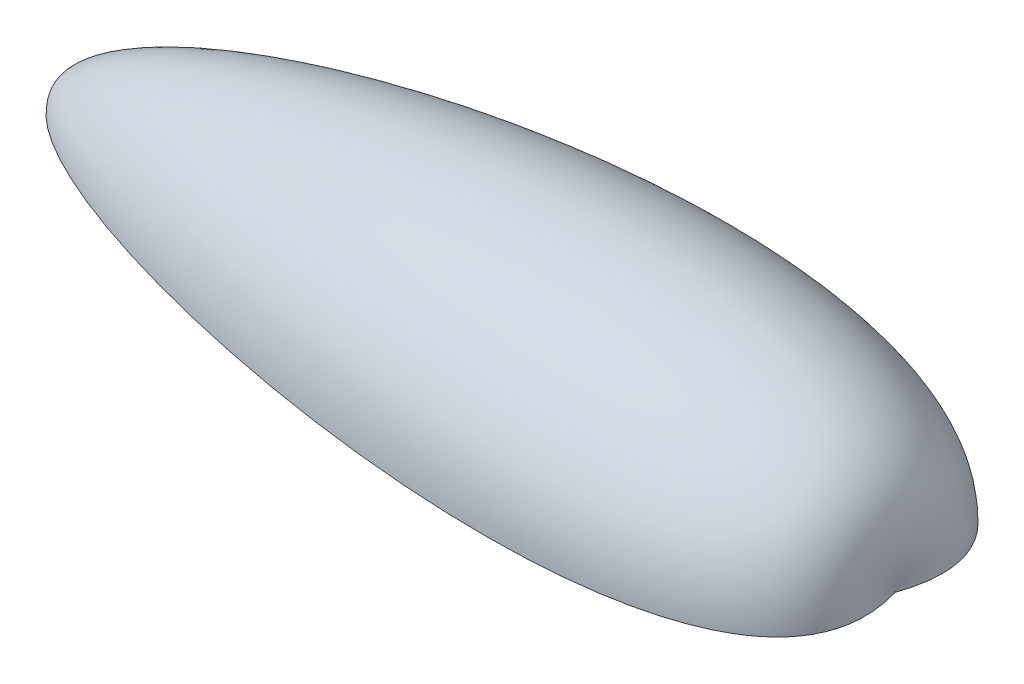
ISO-10303-21;
HEADER;
FILE_DESCRIPTION(('STEP AP214'),'2;1');
FILE_NAME('part.step','',(''),(''),'','','');
FILE_SCHEMA(('AUTOMOTIVE_DESIGN { 1 0 10303 214 1 1 1 1 }'));
ENDSEC;
DATA;
#1=APPLICATION_CONTEXT('core data for automotive mechanical design processes');
#2=APPLICATION_PROTOCOL_DEFINITION('international standard','automotive_design',2000,#1);
#3=PRODUCT_CONTEXT('',#1,'mechanical');
#4=PRODUCT('Part','Part','',(#3));
#5=PRODUCT_RELATED_PRODUCT_CATEGORY('part','',(#4));
#6=PRODUCT_DEFINITION_FORMATION('','',#4);
#7=PRODUCT_DEFINITION_CONTEXT('part definition',#1,'design');
#8=PRODUCT_DEFINITION('design','',#6,#7);
#9=PRODUCT_DEFINITION_SHAPE('','',#8);
#10=(LENGTH_UNIT() NAMED_UNIT(*) SI_UNIT(.MILLI.,.METRE.));
#11=(NAMED_UNIT(*) PLANE_ANGLE_UNIT() SI_UNIT($,.RADIAN.));
#12=(NAMED_UNIT(*) SI_UNIT($,.STERADIAN.) SOLID_ANGLE_UNIT());
#13=UNCERTAINTY_MEASURE_WITH_UNIT(LENGTH_MEASURE(1.E-05),#10,'distance_accuracy_value','');
#14=(GEOMETRIC_REPRESENTATION_CONTEXT(3) GLOBAL_UNCERTAINTY_ASSIGNED_CONTEXT((#13)) GLOBAL_UNIT_ASSIGNED_CONTEXT((#10,
#11,#12)) REPRESENTATION_CONTEXT('',''));
#15=CARTESIAN_POINT('',(0.,0.,0.));
#16=DIRECTION('',(0.,0.,1.));
#17=DIRECTION('',(1.,0.,0.));
#18=AXIS2_PLACEMENT_3D('',#15,#16,#17);
#19=CARTESIAN_POINT('',(39.5224718290114,0.,5.75351714832197));
#20=CARTESIAN_POINT('',(49.8084191254671,-2.41040654463089E-13,40.513258010446));
#21=CARTESIAN_POINT('',(-62.2791697898101,-1.05712964295401E-13,18.5947162287401));
#22=CARTESIAN_POINT('',(-62.0775281709886,0.,3.45670863768368));
#23=B_SPLINE_CURVE_WITH_KNOTS('',3,(#19,#20,#21,#22),.UNSPECIFIED.,.F.,.F.,(4,4),(0.,1.),.UNSPECIFIED.);
#24=CARTESIAN_POINT('',(-62.0775281709886,0.,3.45670863768368));
#25=DIRECTION('',(-0.999744573621602,0.,-0.0226006087121904));
#26=AXIS1_PLACEMENT('',#24,#25);
#27=SURFACE_OF_REVOLUTION('',#23,#26);
#28=CARTESIAN_POINT('',(39.5224718290114,0.,5.75351714832197));
#29=CARTESIAN_POINT('',(51.3686925414079,0.,-28.5058954476445));
#30=CARTESIAN_POINT('',(-61.5948822023994,0.,-11.6749464614232));
#31=CARTESIAN_POINT('',(-62.0775281709886,0.,3.45670863768368));
#32=B_SPLINE_CURVE_WITH_KNOTS('',3,(#28,#29,#30,#31),.UNSPECIFIED.,.F.,.F.,(4,4),(0.,1.),.UNSPECIFIED.);
#33=CARTESIAN_POINT('',(39.5224718290114,0.,5.75351714832197));
#34=VERTEX_POINT('',#33);
#35=CARTESIAN_POINT('',(-62.0775281709886,0.,3.45670863768368));
#36=VERTEX_POINT('',#35);
#37=EDGE_CURVE('E54',#34,#36,#32,.T.);
#38=ORIENTED_EDGE('',*,*,#37,.T.);
#39=EDGE_CURVE('E11',#34,#36,#23,.T.);
#40=ORIENTED_EDGE('',*,*,#39,.F.);
#41=EDGE_LOOP('',(#38,#40));
#42=FACE_BOUND('',#41,.T.);
#43=ADVANCED_FACE('F43',(#42),#27,.T.);
#44=CARTESIAN_POINT('',(-7.49591354187577,-1.30032607034434E-13,23.3167685629455));
#45=DIRECTION('',(0.,-1.,0.));
#46=DIRECTION('',(0.0451896718411149,0.,-0.998978424971677));
#47=AXIS2_PLACEMENT_3D('',#44,#45,#46);
#48=PLANE('',#47);
#49=ORIENTED_EDGE('',*,*,#39,.T.);
#50=ORIENTED_EDGE('',*,*,#37,.F.);
#51=EDGE_LOOP('',(#49,#50));
#52=FACE_BOUND('',#51,.T.);
#53=ADVANCED_FACE('F62',(#52),#48,.T.);
#54=CLOSED_SHELL('',(#43,#53));
#55=MANIFOLD_SOLID_BREP('B2',#54);
#56=ADVANCED_BREP_SHAPE_REPRESENTATION('',(#18,#55),#14);
#57=SHAPE_DEFINITION_REPRESENTATION(#9,#56);
ENDSEC;
END-ISO-10303-21;
